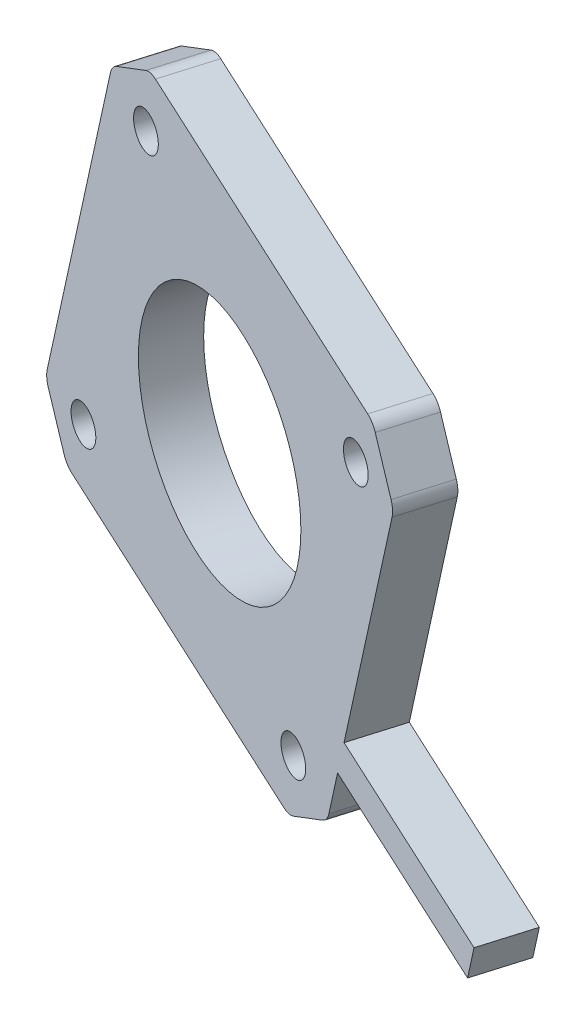
ISO-10303-21;
HEADER;
FILE_DESCRIPTION(('STEP AP214'),'2;1');
FILE_NAME('part.step','',(''),(''),'','','');
FILE_SCHEMA(('AUTOMOTIVE_DESIGN { 1 0 10303 214 1 1 1 1 }'));
ENDSEC;
DATA;
#1=APPLICATION_CONTEXT('core data for automotive mechanical design processes');
#2=APPLICATION_PROTOCOL_DEFINITION('international standard','automotive_design',2000,#1);
#3=PRODUCT_CONTEXT('',#1,'mechanical');
#4=PRODUCT('Part','Part','',(#3));
#5=PRODUCT_RELATED_PRODUCT_CATEGORY('part','',(#4));
#6=PRODUCT_DEFINITION_FORMATION('','',#4);
#7=PRODUCT_DEFINITION_CONTEXT('part definition',#1,'design');
#8=PRODUCT_DEFINITION('design','',#6,#7);
#9=PRODUCT_DEFINITION_SHAPE('','',#8);
#10=(LENGTH_UNIT() NAMED_UNIT(*) SI_UNIT(.MILLI.,.METRE.));
#11=(NAMED_UNIT(*) PLANE_ANGLE_UNIT() SI_UNIT($,.RADIAN.));
#12=(NAMED_UNIT(*) SI_UNIT($,.STERADIAN.) SOLID_ANGLE_UNIT());
#13=UNCERTAINTY_MEASURE_WITH_UNIT(LENGTH_MEASURE(1.E-05),#10,'distance_accuracy_value','');
#14=(GEOMETRIC_REPRESENTATION_CONTEXT(3) GLOBAL_UNCERTAINTY_ASSIGNED_CONTEXT((#13)) GLOBAL_UNIT_ASSIGNED_CONTEXT((#10,
#11,#12)) REPRESENTATION_CONTEXT('',''));
#15=CARTESIAN_POINT('',(0.,0.,0.));
#16=DIRECTION('',(0.,0.,1.));
#17=DIRECTION('',(1.,0.,0.));
#18=AXIS2_PLACEMENT_3D('',#15,#16,#17);
#19=CARTESIAN_POINT('',(201.174917099272,-83.0774959398372,13.686850654498));
#20=DIRECTION('',(-0.285333923385196,0.,0.958428167452111));
#21=DIRECTION('',(0.958428167452111,0.,0.285333923385196));
#22=AXIS2_PLACEMENT_3D('',#19,#20,#21);
#23=CYLINDRICAL_SURFACE('',#22,1.8);
#24=CARTESIAN_POINT('',(199.748247482346,-83.0774959398372,18.4789914917585));
#25=DIRECTION('',(0.285333923385196,0.,-0.958428167452111));
#26=DIRECTION('',(-0.958428167452111,0.,-0.285333923385196));
#27=AXIS2_PLACEMENT_3D('',#24,#25,#26);
#28=CIRCLE('',#27,1.8);
#29=CARTESIAN_POINT('',(201.265487859423,-82.220786831994,18.9306895576246));
#30=VERTEX_POINT('',#29);
#31=CARTESIAN_POINT('',(201.401699676244,-83.5910970019305,18.9712412165021));
#32=VERTEX_POINT('',#31);
#33=EDGE_CURVE('E228',#30,#32,#28,.T.);
#34=ORIENTED_EDGE('',*,*,#33,.T.);
#35=DIRECTION('',(-0.285333923385196,0.,0.958428167452111));
#36=VECTOR('',#35,1.);
#37=CARTESIAN_POINT('',(202.82836929317,-83.5910970019305,14.1791003792416));
#38=LINE('',#37,#36);
#39=CARTESIAN_POINT('',(202.82836929317,-83.5910970019305,14.1791003792416));
#40=VERTEX_POINT('',#39);
#41=EDGE_CURVE('E11',#40,#32,#38,.T.);
#42=ORIENTED_EDGE('',*,*,#41,.F.);
#43=CARTESIAN_POINT('',(201.174917099272,-83.0774959398372,13.686850654498));
#44=DIRECTION('',(0.285333923385196,0.,-0.958428167452111));
#45=DIRECTION('',(-0.958428167452111,0.,-0.285333923385196));
#46=AXIS2_PLACEMENT_3D('',#43,#44,#45);
#47=CIRCLE('',#46,1.8);
#48=CARTESIAN_POINT('',(202.692157476349,-82.220786831994,14.1385487203641));
#49=VERTEX_POINT('',#48);
#50=EDGE_CURVE('E348',#49,#40,#47,.T.);
#51=ORIENTED_EDGE('',*,*,#50,.F.);
#52=DIRECTION('',(-0.285333923385196,0.,0.958428167452111));
#53=VECTOR('',#52,1.);
#54=CARTESIAN_POINT('',(202.692157476349,-82.220786831994,14.1385487203641));
#55=LINE('',#54,#53);
#56=EDGE_CURVE('E224',#49,#30,#55,.T.);
#57=ORIENTED_EDGE('',*,*,#56,.T.);
#58=EDGE_LOOP('',(#34,#42,#51,#57));
#59=FACE_BOUND('',#58,.T.);
#60=ADVANCED_FACE('F43',(#59),#23,.T.);
#61=CARTESIAN_POINT('',(209.253259257463,-61.0740058405717,16.0918562049632));
#62=DIRECTION('',(-0.918584552165611,0.285333923385196,-0.273472069301994));
#63=DIRECTION('',(-0.2966419302804,-0.954988777525432,0.));
#64=AXIS2_PLACEMENT_3D('',#61,#62,#63);
#65=PLANE('',#64);
#66=DIRECTION('',(-0.273472069301994,-0.958428167452111,-0.0814154478343886));
#67=VECTOR('',#66,1.);
#68=CARTESIAN_POINT('',(207.826589640537,-61.0740058405717,20.8839970422238));
#69=LINE('',#68,#67);
#70=CARTESIAN_POINT('',(194.88716484802,-106.422363438587,17.0317971927438));
#71=VERTEX_POINT('',#70);
#72=EDGE_CURVE('E231',#32,#71,#69,.T.);
#73=ORIENTED_EDGE('',*,*,#72,.T.);
#74=DIRECTION('',(-0.285333923385196,0.,0.958428167452111));
#75=VECTOR('',#74,1.);
#76=CARTESIAN_POINT('',(196.313834464946,-106.422363438587,12.2396563554832));
#77=LINE('',#76,#75);
#78=CARTESIAN_POINT('',(196.313834464946,-106.422363438587,12.2396563554832));
#79=VERTEX_POINT('',#78);
#80=EDGE_CURVE('E52',#79,#71,#77,.T.);
#81=ORIENTED_EDGE('',*,*,#80,.F.);
#82=DIRECTION('',(-0.273472069301994,-0.958428167452111,-0.0814154478343886));
#83=VECTOR('',#82,1.);
#84=CARTESIAN_POINT('',(209.253259257463,-61.0740058405717,16.0918562049632));
#85=LINE('',#84,#83);
#86=EDGE_CURVE('E139',#40,#79,#85,.T.);
#87=ORIENTED_EDGE('',*,*,#86,.F.);
#88=ORIENTED_EDGE('',*,*,#41,.T.);
#89=EDGE_LOOP('',(#73,#81,#87,#88));
#90=FACE_BOUND('',#89,.T.);
#91=ADVANCED_FACE('F329',(#90),#65,.F.);
#92=CARTESIAN_POINT('',(-0.303650194546118,-45.3483575980144,-46.2953911412554));
#93=DIRECTION('',(0.273472069301998,0.95842816745211,0.0814154478343897));
#94=DIRECTION('',(-0.961620505139471,0.274382951539103,0.));
#95=AXIS2_PLACEMENT_3D('',#92,#93,#94);
#96=PLANE('',#95);
#97=DIRECTION('',(-0.91858455216561,0.285333923385199,-0.273472069301994));
#98=VECTOR('',#97,1.);
#99=CARTESIAN_POINT('',(-1.7303198114721,-45.3483575980144,-41.5032503039949));
#100=LINE('',#99,#98);
#101=CARTESIAN_POINT('',(212.5239882496,-111.900774767583,22.2824609233421));
#102=VERTEX_POINT('',#101);
#103=EDGE_CURVE('E234',#102,#71,#100,.T.);
#104=ORIENTED_EDGE('',*,*,#103,.F.);
#105=DIRECTION('',(-0.285333923385196,0.,0.958428167452111));
#106=VECTOR('',#105,1.);
#107=CARTESIAN_POINT('',(213.950657866526,-111.900774767583,17.4903200860815));
#108=LINE('',#107,#106);
#109=CARTESIAN_POINT('',(213.950657866526,-111.900774767583,17.4903200860815));
#110=VERTEX_POINT('',#109);
#111=EDGE_CURVE('E322',#110,#102,#108,.T.);
#112=ORIENTED_EDGE('',*,*,#111,.F.);
#113=DIRECTION('',(-0.91858455216561,0.285333923385199,-0.273472069301994));
#114=VECTOR('',#113,1.);
#115=CARTESIAN_POINT('',(-0.303650194546118,-45.3483575980144,-46.2953911412554));
#116=LINE('',#115,#114);
#117=EDGE_CURVE('E328',#110,#79,#116,.T.);
#118=ORIENTED_EDGE('',*,*,#117,.T.);
#119=ORIENTED_EDGE('',*,*,#80,.T.);
#120=EDGE_LOOP('',(#104,#112,#118,#119));
#121=FACE_BOUND('',#120,.T.);
#122=ADVANCED_FACE('F326',(#121),#96,.T.);
#123=CARTESIAN_POINT('',(226.890082659043,-66.5524171695616,21.3425199355617));
#124=DIRECTION('',(0.918584552165618,-0.285333923385172,0.273472069301996));
#125=DIRECTION('',(0.296641930280375,0.954988777525439,0.));
#126=AXIS2_PLACEMENT_3D('',#123,#124,#125);
#127=PLANE('',#126);
#128=DIRECTION('',(0.273472069301972,0.958428167452118,0.0814154478343819));
#129=VECTOR('',#128,1.);
#130=CARTESIAN_POINT('',(225.463413042117,-66.5524171695616,26.1346607728222));
#131=LINE('',#130,#129);
#132=CARTESIAN_POINT('',(211.648877627834,-114.967744903429,22.0219314902721));
#133=VERTEX_POINT('',#132);
#134=EDGE_CURVE('E238',#133,#102,#131,.T.);
#135=ORIENTED_EDGE('',*,*,#134,.F.);
#136=DIRECTION('',(-0.285333923385196,0.,0.958428167452111));
#137=VECTOR('',#136,1.);
#138=CARTESIAN_POINT('',(213.07554724476,-114.967744903429,17.2297906530115));
#139=LINE('',#138,#137);
#140=CARTESIAN_POINT('',(213.07554724476,-114.967744903429,17.2297906530115));
#141=VERTEX_POINT('',#140);
#142=EDGE_CURVE('E320',#141,#133,#139,.T.);
#143=ORIENTED_EDGE('',*,*,#142,.F.);
#144=DIRECTION('',(0.273472069301972,0.958428167452118,0.0814154478343819));
#145=VECTOR('',#144,1.);
#146=CARTESIAN_POINT('',(226.890082659043,-66.5524171695616,21.3425199355617));
#147=LINE('',#146,#145);
#148=EDGE_CURVE('E342',#141,#110,#147,.T.);
#149=ORIENTED_EDGE('',*,*,#148,.T.);
#150=ORIENTED_EDGE('',*,*,#111,.T.);
#151=EDGE_LOOP('',(#135,#143,#149,#150));
#152=FACE_BOUND('',#151,.T.);
#153=ADVANCED_FACE('F339',(#152),#127,.T.);
#154=CARTESIAN_POINT('',(-1.17876081631258,-48.4153277338623,-46.5559205743255));
#155=DIRECTION('',(-0.273472069301993,-0.958428167452111,-0.0814154478343883));
#156=DIRECTION('',(0.961620505139472,-0.274382951539098,0.));
#157=AXIS2_PLACEMENT_3D('',#154,#155,#156);
#158=PLANE('',#157);
#159=DIRECTION('',(0.918584552165612,-0.285333923385195,0.273472069301994));
#160=VECTOR('',#159,1.);
#161=CARTESIAN_POINT('',(-2.60543043323856,-48.4153277338623,-41.7637797370649));
#162=LINE('',#161,#160);
#163=CARTESIAN_POINT('',(194.012054226254,-109.489333574434,16.7712677596738));
#164=VERTEX_POINT('',#163);
#165=EDGE_CURVE('E241',#164,#133,#162,.T.);
#166=ORIENTED_EDGE('',*,*,#165,.F.);
#167=DIRECTION('',(-0.285333923385196,0.,0.958428167452111));
#168=VECTOR('',#167,1.);
#169=CARTESIAN_POINT('',(195.43872384318,-109.489333574434,11.9791269224132));
#170=LINE('',#169,#168);
#171=CARTESIAN_POINT('',(195.43872384318,-109.489333574434,11.9791269224132));
#172=VERTEX_POINT('',#171);
#173=EDGE_CURVE('E318',#172,#164,#170,.T.);
#174=ORIENTED_EDGE('',*,*,#173,.F.);
#175=DIRECTION('',(0.918584552165612,-0.285333923385195,0.273472069301994));
#176=VECTOR('',#175,1.);
#177=CARTESIAN_POINT('',(-1.17876081631258,-48.4153277338623,-46.5559205743255));
#178=LINE('',#177,#176);
#179=EDGE_CURVE('E346',#172,#141,#178,.T.);
#180=ORIENTED_EDGE('',*,*,#179,.T.);
#181=ORIENTED_EDGE('',*,*,#142,.T.);
#182=EDGE_LOOP('',(#166,#174,#180,#181));
#183=FACE_BOUND('',#182,.T.);
#184=ADVANCED_FACE('F410',(#183),#158,.T.);
#185=CARTESIAN_POINT('',(192.830224749419,-113.631250745774,16.419424968686));
#186=VERTEX_POINT('',#185);
#187=EDGE_CURVE('E235',#164,#186,#69,.T.);
#188=ORIENTED_EDGE('',*,*,#187,.T.);
#189=DIRECTION('',(-0.285333923385196,0.,0.958428167452111));
#190=VECTOR('',#189,1.);
#191=CARTESIAN_POINT('',(194.256894366345,-113.631250745774,11.6272841314255));
#192=LINE('',#191,#190);
#193=CARTESIAN_POINT('',(194.256894366345,-113.631250745774,11.6272841314255));
#194=VERTEX_POINT('',#193);
#195=EDGE_CURVE('E315',#194,#186,#192,.T.);
#196=ORIENTED_EDGE('',*,*,#195,.F.);
#197=EDGE_CURVE('E350',#172,#194,#85,.T.);
#198=ORIENTED_EDGE('',*,*,#197,.F.);
#199=ORIENTED_EDGE('',*,*,#173,.T.);
#200=EDGE_LOOP('',(#188,#196,#198,#199));
#201=FACE_BOUND('',#200,.T.);
#202=ADVANCED_FACE('F404',(#201),#65,.F.);
#203=CARTESIAN_POINT('',(192.603442172447,-113.117649683681,11.1350344066819));
#204=DIRECTION('',(-0.285333923385196,0.,0.958428167452111));
#205=DIRECTION('',(0.958428167452111,0.,0.285333923385196));
#206=AXIS2_PLACEMENT_3D('',#203,#204,#205);
#207=CYLINDRICAL_SURFACE('',#206,1.8);
#208=CARTESIAN_POINT('',(191.176772555521,-113.117649683681,15.9271752439425));
#209=DIRECTION('',(0.285333923385196,0.,-0.958428167452111));
#210=DIRECTION('',(-0.958428167452111,0.,-0.285333923385196));
#211=AXIS2_PLACEMENT_3D('',#208,#209,#210);
#212=CIRCLE('',#211,1.8);
#213=CARTESIAN_POINT('',(191.997866695791,-114.700700379186,16.1716234148832));
#214=VERTEX_POINT('',#213);
#215=EDGE_CURVE('E244',#186,#214,#212,.T.);
#216=ORIENTED_EDGE('',*,*,#215,.T.);
#217=DIRECTION('',(-0.285333923385196,0.,0.958428167452111));
#218=VECTOR('',#217,1.);
#219=CARTESIAN_POINT('',(193.424536312717,-114.700700379186,11.3794825776227));
#220=LINE('',#219,#218);
#221=CARTESIAN_POINT('',(193.424536312717,-114.700700379186,11.3794825776227));
#222=VERTEX_POINT('',#221);
#223=EDGE_CURVE('E312',#222,#214,#220,.T.);
#224=ORIENTED_EDGE('',*,*,#223,.F.);
#225=CARTESIAN_POINT('',(192.603442172447,-113.117649683681,11.1350344066819));
#226=DIRECTION('',(0.285333923385196,0.,-0.958428167452111));
#227=DIRECTION('',(-0.958428167452111,0.,-0.285333923385196));
#228=AXIS2_PLACEMENT_3D('',#225,#226,#227);
#229=CIRCLE('',#228,1.8);
#230=EDGE_CURVE('E354',#194,#222,#229,.T.);
#231=ORIENTED_EDGE('',*,*,#230,.F.);
#232=ORIENTED_EDGE('',*,*,#195,.T.);
#233=EDGE_LOOP('',(#216,#224,#231,#232));
#234=FACE_BOUND('',#233,.T.);
#235=ADVANCED_FACE('F415',(#234),#207,.T.);
#236=CARTESIAN_POINT('',(99.6054755998931,-167.675591514658,-16.5514167746664));
#237=DIRECTION('',(-0.456163411260954,0.879472608613818,-0.135804539411522));
#238=DIRECTION('',(-0.887696540554657,-0.460428986801759,0.));
#239=AXIS2_PLACEMENT_3D('',#236,#237,#238);
#240=PLANE('',#239);
#241=DIRECTION('',(-0.842911320598069,-0.475949504357349,-0.250943369925593));
#242=VECTOR('',#241,1.);
#243=CARTESIAN_POINT('',(98.1788059829671,-167.675591514658,-11.7592759374059));
#244=LINE('',#243,#242);
#245=CARTESIAN_POINT('',(188.030193102664,-116.941045518648,14.9904061766126));
#246=VERTEX_POINT('',#245);
#247=EDGE_CURVE('E246',#214,#246,#244,.T.);
#248=ORIENTED_EDGE('',*,*,#247,.T.);
#249=DIRECTION('',(-0.285333923385196,0.,0.958428167452111));
#250=VECTOR('',#249,1.);
#251=CARTESIAN_POINT('',(189.45686271959,-116.941045518648,10.1982653393521));
#252=LINE('',#251,#250);
#253=CARTESIAN_POINT('',(189.45686271959,-116.941045518648,10.1982653393521));
#254=VERTEX_POINT('',#253);
#255=EDGE_CURVE('E309',#254,#246,#252,.T.);
#256=ORIENTED_EDGE('',*,*,#255,.F.);
#257=DIRECTION('',(-0.842911320598069,-0.475949504357349,-0.250943369925593));
#258=VECTOR('',#257,1.);
#259=CARTESIAN_POINT('',(99.6054755998931,-167.675591514658,-16.5514167746664));
#260=LINE('',#259,#258);
#261=EDGE_CURVE('E356',#222,#254,#260,.T.);
#262=ORIENTED_EDGE('',*,*,#261,.F.);
#263=ORIENTED_EDGE('',*,*,#223,.T.);
#264=EDGE_LOOP('',(#248,#256,#262,#263));
#265=FACE_BOUND('',#264,.T.);
#266=ADVANCED_FACE('F419',(#265),#240,.F.);
#267=CARTESIAN_POINT('',(188.635768579321,-115.357994823143,9.95381716841133));
#268=DIRECTION('',(-0.285333923385196,0.,0.958428167452111));
#269=DIRECTION('',(0.958428167452111,0.,0.285333923385196));
#270=AXIS2_PLACEMENT_3D('',#267,#268,#269);
#271=CYLINDRICAL_SURFACE('',#270,1.8);
#272=CARTESIAN_POINT('',(187.209098962395,-115.357994823143,14.7459580056719));
#273=DIRECTION('',(0.285333923385196,0.,-0.958428167452111));
#274=DIRECTION('',(-0.958428167452111,0.,-0.285333923385196));
#275=AXIS2_PLACEMENT_3D('',#272,#273,#274);
#276=CIRCLE('',#275,1.8);
#277=CARTESIAN_POINT('',(186.716849237651,-117.083165524557,14.59941019957));
#278=VERTEX_POINT('',#277);
#279=EDGE_CURVE('E248',#246,#278,#276,.T.);
#280=ORIENTED_EDGE('',*,*,#279,.T.);
#281=DIRECTION('',(-0.285333923385196,0.,0.958428167452111));
#282=VECTOR('',#281,1.);
#283=CARTESIAN_POINT('',(188.143518854577,-117.083165524557,9.80726936230944));
#284=LINE('',#283,#282);
#285=CARTESIAN_POINT('',(188.143518854577,-117.083165524557,9.80726936230944));
#286=VERTEX_POINT('',#285);
#287=EDGE_CURVE('E306',#286,#278,#284,.T.);
#288=ORIENTED_EDGE('',*,*,#287,.F.);
#289=CARTESIAN_POINT('',(188.635768579321,-115.357994823143,9.95381716841133));
#290=DIRECTION('',(0.285333923385196,0.,-0.958428167452111));
#291=DIRECTION('',(-0.958428167452111,0.,-0.285333923385196));
#292=AXIS2_PLACEMENT_3D('',#289,#290,#291);
#293=CIRCLE('',#292,1.8);
#294=EDGE_CURVE('E358',#254,#286,#293,.T.);
#295=ORIENTED_EDGE('',*,*,#294,.F.);
#296=ORIENTED_EDGE('',*,*,#255,.T.);
#297=EDGE_LOOP('',(#280,#288,#295,#296));
#298=FACE_BOUND('',#297,.T.);
#299=ADVANCED_FACE('F423',(#298),#271,.T.);
#300=CARTESIAN_POINT('',(-3.7630718712164,-57.4724739162845,-47.3252965563605));
#301=DIRECTION('',(0.273472069301994,0.958428167452111,0.0814154478343885));
#302=DIRECTION('',(-0.961620505139472,0.274382951539099,0.));
#303=AXIS2_PLACEMENT_3D('',#300,#301,#302);
#304=PLANE('',#303);
#305=DIRECTION('',(-0.918584552165611,0.285333923385195,-0.273472069301994));
#306=VECTOR('',#305,1.);
#307=CARTESIAN_POINT('',(-5.18974148814238,-57.4724739162845,-42.5331557190999));
#308=LINE('',#307,#306);
#309=CARTESIAN_POINT('',(157.92551973496,-108.139902776331,6.02793527274466));
#310=VERTEX_POINT('',#309);
#311=EDGE_CURVE('E250',#278,#310,#308,.T.);
#312=ORIENTED_EDGE('',*,*,#311,.T.);
#313=DIRECTION('',(-0.285333923385196,0.,0.958428167452111));
#314=VECTOR('',#313,1.);
#315=CARTESIAN_POINT('',(159.352189351886,-108.139902776331,1.2357944354841));
#316=LINE('',#315,#314);
#317=CARTESIAN_POINT('',(159.352189351886,-108.139902776331,1.2357944354841));
#318=VERTEX_POINT('',#317);
#319=EDGE_CURVE('E303',#318,#310,#316,.T.);
#320=ORIENTED_EDGE('',*,*,#319,.F.);
#321=DIRECTION('',(-0.918584552165611,0.285333923385195,-0.273472069301994));
#322=VECTOR('',#321,1.);
#323=CARTESIAN_POINT('',(-3.7630718712164,-57.4724739162845,-47.3252965563605));
#324=LINE('',#323,#322);
#325=EDGE_CURVE('E360',#286,#318,#324,.T.);
#326=ORIENTED_EDGE('',*,*,#325,.F.);
#327=ORIENTED_EDGE('',*,*,#287,.T.);
#328=EDGE_LOOP('',(#312,#320,#326,#327));
#329=FACE_BOUND('',#328,.T.);
#330=ADVANCED_FACE('F427',(#329),#304,.F.);
#331=CARTESIAN_POINT('',(159.844439076629,-106.414732074917,1.382342241586));
#332=DIRECTION('',(-0.285333923385196,0.,0.958428167452111));
#333=DIRECTION('',(0.958428167452111,0.,0.285333923385196));
#334=AXIS2_PLACEMENT_3D('',#331,#332,#333);
#335=CYLINDRICAL_SURFACE('',#334,1.8);
#336=CARTESIAN_POINT('',(158.417769459703,-106.414732074917,6.17448307884656));
#337=DIRECTION('',(0.285333923385196,0.,-0.958428167452111));
#338=DIRECTION('',(-0.958428167452111,0.,-0.285333923385196));
#339=AXIS2_PLACEMENT_3D('',#336,#337,#338);
#340=CIRCLE('',#339,1.8);
#341=CARTESIAN_POINT('',(156.900529082627,-107.27144118276,5.72278501298049));
#342=VERTEX_POINT('',#341);
#343=EDGE_CURVE('E252',#310,#342,#340,.T.);
#344=ORIENTED_EDGE('',*,*,#343,.T.);
#345=DIRECTION('',(-0.285333923385196,0.,0.958428167452111));
#346=VECTOR('',#345,1.);
#347=CARTESIAN_POINT('',(158.327198699553,-107.27144118276,0.930644175719936));
#348=LINE('',#347,#346);
#349=CARTESIAN_POINT('',(158.327198699553,-107.27144118276,0.930644175719936));
#350=VERTEX_POINT('',#349);
#351=EDGE_CURVE('E300',#350,#342,#348,.T.);
#352=ORIENTED_EDGE('',*,*,#351,.F.);
#353=CARTESIAN_POINT('',(159.844439076629,-106.414732074917,1.382342241586));
#354=DIRECTION('',(0.285333923385196,0.,-0.958428167452111));
#355=DIRECTION('',(-0.958428167452111,0.,-0.285333923385196));
#356=AXIS2_PLACEMENT_3D('',#353,#354,#355);
#357=CIRCLE('',#356,1.8);
#358=EDGE_CURVE('E362',#318,#350,#357,.T.);
#359=ORIENTED_EDGE('',*,*,#358,.F.);
#360=ORIENTED_EDGE('',*,*,#319,.T.);
#361=EDGE_LOOP('',(#344,#352,#359,#360));
#362=FACE_BOUND('',#361,.T.);
#363=ADVANCED_FACE('F431',(#362),#335,.T.);
#364=CARTESIAN_POINT('',(82.2885191258326,39.3293913903581,-21.7068528309437));
#365=DIRECTION('',(0.842911320598069,0.475949504357349,0.250943369925593));
#366=DIRECTION('',(-0.491682473650863,0.870774566179197,0.));
#367=AXIS2_PLACEMENT_3D('',#364,#365,#366);
#368=PLANE('',#367);
#369=DIRECTION('',(-0.456163411260954,0.879472608613818,-0.135804539411522));
#370=VECTOR('',#369,1.);
#371=CARTESIAN_POINT('',(80.8618495089067,39.3293913903581,-16.9147119936832));
#372=LINE('',#371,#370);
#373=CARTESIAN_POINT('',(154.753319196151,-103.131669702886,5.08353854460059));
#374=VERTEX_POINT('',#373);
#375=EDGE_CURVE('E254',#342,#374,#372,.T.);
#376=ORIENTED_EDGE('',*,*,#375,.T.);
#377=DIRECTION('',(-0.285333923385196,0.,0.958428167452111));
#378=VECTOR('',#377,1.);
#379=CARTESIAN_POINT('',(156.179988813077,-103.131669702886,0.291397707340032));
#380=LINE('',#379,#378);
#381=CARTESIAN_POINT('',(156.179988813077,-103.131669702886,0.291397707340032));
#382=VERTEX_POINT('',#381);
#383=EDGE_CURVE('E297',#382,#374,#380,.T.);
#384=ORIENTED_EDGE('',*,*,#383,.F.);
#385=DIRECTION('',(-0.456163411260954,0.879472608613818,-0.135804539411522));
#386=VECTOR('',#385,1.);
#387=CARTESIAN_POINT('',(82.2885191258326,39.3293913903581,-21.7068528309437));
#388=LINE('',#387,#386);
#389=EDGE_CURVE('E364',#350,#382,#388,.T.);
#390=ORIENTED_EDGE('',*,*,#389,.F.);
#391=ORIENTED_EDGE('',*,*,#351,.T.);
#392=EDGE_LOOP('',(#376,#384,#390,#391));
#393=FACE_BOUND('',#392,.T.);
#394=ADVANCED_FACE('F435',(#393),#368,.F.);
#395=CARTESIAN_POINT('',(157.697229190154,-102.274960595043,0.743095773206102));
#396=DIRECTION('',(-0.285333923385196,0.,0.958428167452111));
#397=DIRECTION('',(0.958428167452111,0.,0.285333923385196));
#398=AXIS2_PLACEMENT_3D('',#395,#396,#397);
#399=CYLINDRICAL_SURFACE('',#398,1.8);
#400=CARTESIAN_POINT('',(156.270559573228,-102.274960595043,5.53523661046666));
#401=DIRECTION('',(0.285333923385196,0.,-0.958428167452111));
#402=DIRECTION('',(-0.958428167452111,0.,-0.285333923385196));
#403=AXIS2_PLACEMENT_3D('',#400,#401,#402);
#404=CIRCLE('',#403,1.8);
#405=CARTESIAN_POINT('',(154.617107379329,-101.76135953295,5.04298688572308));
#406=VERTEX_POINT('',#405);
#407=EDGE_CURVE('E256',#374,#406,#404,.T.);
#408=ORIENTED_EDGE('',*,*,#407,.T.);
#409=DIRECTION('',(-0.285333923385196,0.,0.958428167452111));
#410=VECTOR('',#409,1.);
#411=CARTESIAN_POINT('',(156.043776996255,-101.76135953295,0.250846048462528));
#412=LINE('',#411,#410);
#413=CARTESIAN_POINT('',(156.043776996255,-101.76135953295,0.250846048462528));
#414=VERTEX_POINT('',#413);
#415=EDGE_CURVE('E294',#414,#406,#412,.T.);
#416=ORIENTED_EDGE('',*,*,#415,.F.);
#417=CARTESIAN_POINT('',(157.697229190154,-102.274960595043,0.743095773206102));
#418=DIRECTION('',(0.285333923385196,0.,-0.958428167452111));
#419=DIRECTION('',(-0.958428167452111,0.,-0.285333923385196));
#420=AXIS2_PLACEMENT_3D('',#417,#418,#419);
#421=CIRCLE('',#420,1.8);
#422=EDGE_CURVE('E366',#382,#414,#421,.T.);
#423=ORIENTED_EDGE('',*,*,#422,.F.);
#424=ORIENTED_EDGE('',*,*,#383,.T.);
#425=EDGE_LOOP('',(#408,#416,#423,#424));
#426=FACE_BOUND('',#425,.T.);
#427=ADVANCED_FACE('F439',(#426),#399,.T.);
#428=CARTESIAN_POINT('',(171.040141887373,-49.2041146277476,4.7154181220003));
#429=DIRECTION('',(0.918584552165611,-0.285333923385196,0.273472069301994));
#430=DIRECTION('',(0.2966419302804,0.954988777525432,0.));
#431=AXIS2_PLACEMENT_3D('',#428,#429,#430);
#432=PLANE('',#431);
#433=DIRECTION('',(0.273472069301994,0.958428167452111,0.0814154478343886));
#434=VECTOR('',#433,1.);
#435=CARTESIAN_POINT('',(169.613472270447,-49.2041146277476,9.50755895926086));
#436=LINE('',#435,#434);
#437=CARTESIAN_POINT('',(163.188582306155,-71.7212057891064,7.59480313353918));
#438=VERTEX_POINT('',#437);
#439=EDGE_CURVE('E258',#406,#438,#436,.T.);
#440=ORIENTED_EDGE('',*,*,#439,.T.);
#441=DIRECTION('',(-0.285333923385196,0.,0.958428167452111));
#442=VECTOR('',#441,1.);
#443=CARTESIAN_POINT('',(164.615251923081,-71.7212057891064,2.80266229627863));
#444=LINE('',#443,#442);
#445=CARTESIAN_POINT('',(164.615251923081,-71.7212057891064,2.80266229627863));
#446=VERTEX_POINT('',#445);
#447=EDGE_CURVE('E291',#446,#438,#444,.T.);
#448=ORIENTED_EDGE('',*,*,#447,.F.);
#449=DIRECTION('',(0.273472069301994,0.958428167452111,0.0814154478343886));
#450=VECTOR('',#449,1.);
#451=CARTESIAN_POINT('',(171.040141887373,-49.2041146277476,4.7154181220003));
#452=LINE('',#451,#450);
#453=EDGE_CURVE('E368',#414,#446,#452,.T.);
#454=ORIENTED_EDGE('',*,*,#453,.F.);
#455=ORIENTED_EDGE('',*,*,#415,.T.);
#456=EDGE_LOOP('',(#440,#448,#454,#455));
#457=FACE_BOUND('',#456,.T.);
#458=ADVANCED_FACE('F443',(#457),#432,.F.);
#459=CARTESIAN_POINT('',(166.268704116979,-72.2348068511998,3.29491202102222));
#460=DIRECTION('',(-0.285333923385196,0.,0.958428167452111));
#461=DIRECTION('',(0.958428167452111,0.,0.285333923385196));
#462=AXIS2_PLACEMENT_3D('',#459,#460,#461);
#463=CYLINDRICAL_SURFACE('',#462,1.8);
#464=CARTESIAN_POINT('',(164.842034500053,-72.2348068511998,8.08705285828278));
#465=DIRECTION('',(0.285333923385196,0.,-0.958428167452111));
#466=DIRECTION('',(-0.958428167452111,0.,-0.285333923385196));
#467=AXIS2_PLACEMENT_3D('',#464,#465,#466);
#468=CIRCLE('',#467,1.8);
#469=CARTESIAN_POINT('',(164.020940359783,-70.6517561556949,7.84260468734201));
#470=VERTEX_POINT('',#469);
#471=EDGE_CURVE('E260',#438,#470,#468,.T.);
#472=ORIENTED_EDGE('',*,*,#471,.T.);
#473=DIRECTION('',(-0.285333923385196,0.,0.958428167452111));
#474=VECTOR('',#473,1.);
#475=CARTESIAN_POINT('',(165.447609976709,-70.6517561556949,3.05046385008146));
#476=LINE('',#475,#474);
#477=CARTESIAN_POINT('',(165.447609976709,-70.6517561556949,3.05046385008146));
#478=VERTEX_POINT('',#477);
#479=EDGE_CURVE('E288',#478,#470,#476,.T.);
#480=ORIENTED_EDGE('',*,*,#479,.F.);
#481=CARTESIAN_POINT('',(166.268704116979,-72.2348068511998,3.29491202102222));
#482=DIRECTION('',(0.285333923385196,0.,-0.958428167452111));
#483=DIRECTION('',(-0.958428167452111,0.,-0.285333923385196));
#484=AXIS2_PLACEMENT_3D('',#481,#482,#483);
#485=CIRCLE('',#484,1.8);
#486=EDGE_CURVE('E370',#446,#478,#485,.T.);
#487=ORIENTED_EDGE('',*,*,#486,.F.);
#488=ORIENTED_EDGE('',*,*,#447,.T.);
#489=EDGE_LOOP('',(#472,#480,#487,#488));
#490=FACE_BOUND('',#489,.T.);
#491=ADVANCED_FACE('F447',(#490),#463,.T.);
#492=CARTESIAN_POINT('',(75.5962228570118,-121.386302151705,-23.699218263937));
#493=DIRECTION('',(0.456163411260954,-0.879472608613818,0.135804539411522));
#494=DIRECTION('',(0.887696540554657,0.460428986801759,0.));
#495=AXIS2_PLACEMENT_3D('',#492,#493,#494);
#496=PLANE('',#495);
#497=DIRECTION('',(0.842911320598069,0.475949504357349,0.250943369925593));
#498=VECTOR('',#497,1.);
#499=CARTESIAN_POINT('',(74.1695532400858,-121.386302151705,-18.9070774266765));
#500=LINE('',#499,#498);
#501=CARTESIAN_POINT('',(167.988613952909,-68.411411016232,9.02382192561257));
#502=VERTEX_POINT('',#501);
#503=EDGE_CURVE('E262',#470,#502,#500,.T.);
#504=ORIENTED_EDGE('',*,*,#503,.T.);
#505=DIRECTION('',(-0.285333923385196,0.,0.958428167452111));
#506=VECTOR('',#505,1.);
#507=CARTESIAN_POINT('',(169.415283569835,-68.411411016232,4.23168108835202));
#508=LINE('',#507,#506);
#509=CARTESIAN_POINT('',(169.415283569835,-68.411411016232,4.23168108835202));
#510=VERTEX_POINT('',#509);
#511=EDGE_CURVE('E285',#510,#502,#508,.T.);
#512=ORIENTED_EDGE('',*,*,#511,.F.);
#513=DIRECTION('',(0.842911320598069,0.475949504357349,0.250943369925593));
#514=VECTOR('',#513,1.);
#515=CARTESIAN_POINT('',(75.5962228570118,-121.386302151705,-23.699218263937));
#516=LINE('',#515,#514);
#517=EDGE_CURVE('E372',#478,#510,#516,.T.);
#518=ORIENTED_EDGE('',*,*,#517,.F.);
#519=ORIENTED_EDGE('',*,*,#479,.T.);
#520=EDGE_LOOP('',(#504,#512,#518,#519));
#521=FACE_BOUND('',#520,.T.);
#522=ADVANCED_FACE('F378',(#521),#496,.F.);
#523=CARTESIAN_POINT('',(170.236377710105,-69.9944617117369,4.47612925929277));
#524=DIRECTION('',(-0.285333923385196,0.,0.958428167452111));
#525=DIRECTION('',(0.958428167452111,0.,0.285333923385196));
#526=AXIS2_PLACEMENT_3D('',#523,#524,#525);
#527=CYLINDRICAL_SURFACE('',#526,1.8);
#528=CARTESIAN_POINT('',(168.809708093179,-69.9944617117369,9.26827009655332));
#529=DIRECTION('',(0.285333923385196,0.,-0.958428167452111));
#530=DIRECTION('',(-0.958428167452111,0.,-0.285333923385196));
#531=AXIS2_PLACEMENT_3D('',#528,#529,#530);
#532=CIRCLE('',#531,1.8);
#533=CARTESIAN_POINT('',(169.301957817922,-68.2692910103231,9.41481790265521));
#534=VERTEX_POINT('',#533);
#535=EDGE_CURVE('E264',#502,#534,#532,.T.);
#536=ORIENTED_EDGE('',*,*,#535,.T.);
#537=DIRECTION('',(-0.285333923385196,0.,0.958428167452111));
#538=VECTOR('',#537,1.);
#539=CARTESIAN_POINT('',(170.728627434848,-68.2692910103231,4.62267706539466));
#540=LINE('',#539,#538);
#541=CARTESIAN_POINT('',(170.728627434848,-68.2692910103231,4.62267706539466));
#542=VERTEX_POINT('',#541);
#543=EDGE_CURVE('E204',#542,#534,#540,.T.);
#544=ORIENTED_EDGE('',*,*,#543,.F.);
#545=CARTESIAN_POINT('',(170.236377710105,-69.9944617117369,4.47612925929277));
#546=DIRECTION('',(0.285333923385196,0.,-0.958428167452111));
#547=DIRECTION('',(-0.958428167452111,0.,-0.285333923385196));
#548=AXIS2_PLACEMENT_3D('',#545,#546,#547);
#549=CIRCLE('',#548,1.8);
#550=EDGE_CURVE('E195',#510,#542,#549,.T.);
#551=ORIENTED_EDGE('',*,*,#550,.F.);
#552=ORIENTED_EDGE('',*,*,#511,.T.);
#553=EDGE_LOOP('',(#536,#544,#551,#552));
#554=FACE_BOUND('',#553,.T.);
#555=ADVANCED_FACE('F382',(#554),#527,.T.);
#556=CARTESIAN_POINT('',(7.61336621174655,-17.6018621502766,-43.9384139264499));
#557=DIRECTION('',(-0.273472069301994,-0.958428167452111,-0.0814154478343886));
#558=DIRECTION('',(0.961620505139472,-0.274382951539099,0.));
#559=AXIS2_PLACEMENT_3D('',#556,#557,#558);
#560=PLANE('',#559);
#561=DIRECTION('',(0.918584552165611,-0.285333923385196,0.273472069301994));
#562=VECTOR('',#561,1.);
#563=CARTESIAN_POINT('',(6.18669659482057,-17.6018621502766,-39.1462730891893));
#564=LINE('',#563,#562);
#565=CARTESIAN_POINT('',(198.093287320614,-77.2125537585495,17.9862928294805));
#566=VERTEX_POINT('',#565);
#567=EDGE_CURVE('E203',#534,#566,#564,.T.);
#568=ORIENTED_EDGE('',*,*,#567,.T.);
#569=DIRECTION('',(-0.285333923385196,0.,0.958428167452111));
#570=VECTOR('',#569,1.);
#571=CARTESIAN_POINT('',(199.51995693754,-77.2125537585495,13.19415199222));
#572=LINE('',#571,#570);
#573=CARTESIAN_POINT('',(199.51995693754,-77.2125537585495,13.19415199222));
#574=VERTEX_POINT('',#573);
#575=EDGE_CURVE('E200',#574,#566,#572,.T.);
#576=ORIENTED_EDGE('',*,*,#575,.F.);
#577=DIRECTION('',(0.918584552165611,-0.285333923385196,0.273472069301994));
#578=VECTOR('',#577,1.);
#579=CARTESIAN_POINT('',(7.61336621174655,-17.6018621502766,-43.9384139264499));
#580=LINE('',#579,#578);
#581=EDGE_CURVE('E188',#542,#574,#580,.T.);
#582=ORIENTED_EDGE('',*,*,#581,.F.);
#583=ORIENTED_EDGE('',*,*,#543,.T.);
#584=EDGE_LOOP('',(#568,#576,#582,#583));
#585=FACE_BOUND('',#584,.T.);
#586=ADVANCED_FACE('F201',(#585),#560,.F.);
#587=CARTESIAN_POINT('',(199.027707212796,-78.9377244599633,13.0476041861181));
#588=DIRECTION('',(-0.285333923385196,0.,0.958428167452111));
#589=DIRECTION('',(0.958428167452111,0.,0.285333923385196));
#590=AXIS2_PLACEMENT_3D('',#587,#588,#589);
#591=CYLINDRICAL_SURFACE('',#590,1.8);
#592=CARTESIAN_POINT('',(197.60103759587,-78.9377244599633,17.8397450233786));
#593=DIRECTION('',(0.285333923385196,0.,-0.958428167452111));
#594=DIRECTION('',(-0.958428167452111,0.,-0.285333923385196));
#595=AXIS2_PLACEMENT_3D('',#592,#593,#594);
#596=CIRCLE('',#595,1.8);
#597=CARTESIAN_POINT('',(199.118277972947,-78.08101535212,18.2914430892447));
#598=VERTEX_POINT('',#597);
#599=EDGE_CURVE('E125',#566,#598,#596,.T.);
#600=ORIENTED_EDGE('',*,*,#599,.T.);
#601=DIRECTION('',(-0.285333923385196,0.,0.958428167452111));
#602=VECTOR('',#601,1.);
#603=CARTESIAN_POINT('',(200.544947589873,-78.08101535212,13.4993022519842));
#604=LINE('',#603,#602);
#605=CARTESIAN_POINT('',(200.544947589873,-78.08101535212,13.4993022519842));
#606=VERTEX_POINT('',#605);
#607=EDGE_CURVE('E205',#606,#598,#604,.T.);
#608=ORIENTED_EDGE('',*,*,#607,.F.);
#609=CARTESIAN_POINT('',(199.027707212796,-78.9377244599633,13.0476041861181));
#610=DIRECTION('',(0.285333923385196,0.,-0.958428167452111));
#611=DIRECTION('',(-0.958428167452111,0.,-0.285333923385196));
#612=AXIS2_PLACEMENT_3D('',#609,#610,#611);
#613=CIRCLE('',#612,1.8);
#614=EDGE_CURVE('E193',#574,#606,#613,.T.);
#615=ORIENTED_EDGE('',*,*,#614,.F.);
#616=ORIENTED_EDGE('',*,*,#575,.T.);
#617=EDGE_LOOP('',(#600,#608,#615,#616));
#618=FACE_BOUND('',#617,.T.);
#619=ADVANCED_FACE('F207',(#618),#591,.T.);
#620=CARTESIAN_POINT('',(189.435316629099,-111.954540675418,10.1918508465999));
#621=DIRECTION('',(-0.285333923385196,0.,0.958428167452111));
#622=DIRECTION('',(0.958428167452111,0.,0.285333923385196));
#623=AXIS2_PLACEMENT_3D('',#620,#621,#622);
#624=CYLINDRICAL_SURFACE('',#623,1.75000000000004);
#625=CARTESIAN_POINT('',(189.435316629099,-111.954540675418,10.1918508465999));
#626=DIRECTION('',(0.285333923385196,0.,-0.958428167452111));
#627=DIRECTION('',(-0.958428167452111,0.,-0.285333923385196));
#628=AXIS2_PLACEMENT_3D('',#625,#626,#627);
#629=CIRCLE('',#628,1.75000000000004);
#630=CARTESIAN_POINT('',(187.758067336058,-111.954540675418,9.69251648067582));
#631=VERTEX_POINT('',#630);
#632=EDGE_CURVE('E218',#631,#631,#629,.T.);
#633=ORIENTED_EDGE('',*,*,#632,.T.);
#634=EDGE_LOOP('',(#633));
#635=FACE_BOUND('',#634,.T.);
#636=CARTESIAN_POINT('',(188.008647012173,-111.954540675418,14.9839916838605));
#637=DIRECTION('',(0.285333923385196,0.,-0.958428167452111));
#638=DIRECTION('',(-0.958428167452111,0.,-0.285333923385196));
#639=AXIS2_PLACEMENT_3D('',#636,#637,#638);
#640=CIRCLE('',#639,1.75000000000004);
#641=CARTESIAN_POINT('',(186.331397719132,-111.954540675418,14.4846573179364));
#642=VERTEX_POINT('',#641);
#643=EDGE_CURVE('E275',#642,#642,#640,.T.);
#644=ORIENTED_EDGE('',*,*,#643,.F.);
#645=EDGE_LOOP('',(#644));
#646=FACE_BOUND('',#645,.T.);
#647=ADVANCED_FACE('F458',(#635,#646),#624,.F.);
#648=CARTESIAN_POINT('',(197.912950777461,-82.243267484403,12.715729729466));
#649=DIRECTION('',(-0.285333923385196,0.,0.958428167452111));
#650=DIRECTION('',(0.958428167452111,0.,0.285333923385196));
#651=AXIS2_PLACEMENT_3D('',#648,#649,#650);
#652=CYLINDRICAL_SURFACE('',#651,1.75000000000004);
#653=CARTESIAN_POINT('',(197.912950777461,-82.243267484403,12.715729729466));
#654=DIRECTION('',(0.285333923385196,0.,-0.958428167452111));
#655=DIRECTION('',(-0.958428167452111,0.,-0.285333923385196));
#656=AXIS2_PLACEMENT_3D('',#653,#654,#655);
#657=CIRCLE('',#656,1.75000000000004);
#658=CARTESIAN_POINT('',(196.235701484419,-82.243267484403,12.2163953635419));
#659=VERTEX_POINT('',#658);
#660=EDGE_CURVE('E215',#659,#659,#657,.T.);
#661=ORIENTED_EDGE('',*,*,#660,.T.);
#662=EDGE_LOOP('',(#661));
#663=FACE_BOUND('',#662,.T.);
#664=CARTESIAN_POINT('',(196.486281160535,-82.243267484403,17.5078705667265));
#665=DIRECTION('',(0.285333923385196,0.,-0.958428167452111));
#666=DIRECTION('',(-0.958428167452111,0.,-0.285333923385196));
#667=AXIS2_PLACEMENT_3D('',#664,#665,#666);
#668=CIRCLE('',#667,1.75000000000004);
#669=CARTESIAN_POINT('',(194.809031867493,-82.243267484403,17.0085362008024));
#670=VERTEX_POINT('',#669);
#671=EDGE_CURVE('E272',#670,#670,#668,.T.);
#672=ORIENTED_EDGE('',*,*,#671,.F.);
#673=EDGE_LOOP('',(#672));
#674=FACE_BOUND('',#673,.T.);
#675=ADVANCED_FACE('F395',(#663,#674),#652,.F.);
#676=CARTESIAN_POINT('',(169.436829660327,-73.3979158594619,4.23809558110415));
#677=DIRECTION('',(-0.285333923385196,0.,0.958428167452111));
#678=DIRECTION('',(0.958428167452111,0.,0.285333923385196));
#679=AXIS2_PLACEMENT_3D('',#676,#677,#678);
#680=CYLINDRICAL_SURFACE('',#679,1.75000000000004);
#681=CARTESIAN_POINT('',(169.436829660327,-73.3979158594619,4.23809558110415));
#682=DIRECTION('',(0.285333923385196,0.,-0.958428167452111));
#683=DIRECTION('',(-0.958428167452111,0.,-0.285333923385196));
#684=AXIS2_PLACEMENT_3D('',#681,#682,#683);
#685=CIRCLE('',#684,1.75000000000004);
#686=CARTESIAN_POINT('',(167.759580367285,-73.3979158594619,3.73876121518004));
#687=VERTEX_POINT('',#686);
#688=EDGE_CURVE('E209',#687,#687,#685,.T.);
#689=ORIENTED_EDGE('',*,*,#688,.T.);
#690=EDGE_LOOP('',(#689));
#691=FACE_BOUND('',#690,.T.);
#692=CARTESIAN_POINT('',(168.010160043401,-73.3979158594619,9.0302364183647));
#693=DIRECTION('',(0.285333923385196,0.,-0.958428167452111));
#694=DIRECTION('',(-0.958428167452111,0.,-0.285333923385196));
#695=AXIS2_PLACEMENT_3D('',#692,#693,#694);
#696=CIRCLE('',#695,1.75000000000004);
#697=CARTESIAN_POINT('',(166.33291075036,-73.3979158594619,8.5309020524406));
#698=VERTEX_POINT('',#697);
#699=EDGE_CURVE('E269',#698,#698,#696,.T.);
#700=ORIENTED_EDGE('',*,*,#699,.F.);
#701=EDGE_LOOP('',(#700));
#702=FACE_BOUND('',#701,.T.);
#703=ADVANCED_FACE('F387',(#691,#702),#680,.F.);
#704=CARTESIAN_POINT('',(126.653477902629,64.3800457411245,-8.49894828629959));
#705=DIRECTION('',(-0.842911320598069,-0.475949504357349,-0.250943369925593));
#706=DIRECTION('',(0.491682473650863,-0.870774566179197,0.));
#707=AXIS2_PLACEMENT_3D('',#704,#705,#706);
#708=PLANE('',#707);
#709=DIRECTION('',(0.456163411260954,-0.879472608613818,0.135804539411522));
#710=VECTOR('',#709,1.);
#711=CARTESIAN_POINT('',(125.226808285703,64.3800457411245,-3.70680744903904));
#712=LINE('',#711,#710);
#713=EDGE_CURVE('E131',#598,#30,#712,.T.);
#714=ORIENTED_EDGE('',*,*,#713,.T.);
#715=ORIENTED_EDGE('',*,*,#56,.F.);
#716=DIRECTION('',(0.456163411260954,-0.879472608613818,0.135804539411522));
#717=VECTOR('',#716,1.);
#718=CARTESIAN_POINT('',(126.653477902629,64.3800457411245,-8.49894828629959));
#719=LINE('',#718,#717);
#720=EDGE_CURVE('E60',#606,#49,#719,.T.);
#721=ORIENTED_EDGE('',*,*,#720,.F.);
#722=ORIENTED_EDGE('',*,*,#607,.T.);
#723=EDGE_LOOP('',(#714,#715,#721,#722));
#724=FACE_BOUND('',#723,.T.);
#725=ADVANCED_FACE('F385',(#724),#708,.F.);
#726=CARTESIAN_POINT('',(179.436073144713,-92.6762282674402,7.21497321385205));
#727=DIRECTION('',(-0.285333923385196,0.,0.958428167452111));
#728=DIRECTION('',(0.958428167452111,0.,0.285333923385196));
#729=AXIS2_PLACEMENT_3D('',#726,#727,#728);
#730=CYLINDRICAL_SURFACE('',#729,11.5);
#731=CARTESIAN_POINT('',(179.436073144713,-92.6762282674402,7.21497321385205));
#732=DIRECTION('',(0.285333923385196,0.,-0.958428167452111));
#733=DIRECTION('',(-0.958428167452111,0.,-0.285333923385196));
#734=AXIS2_PLACEMENT_3D('',#731,#732,#733);
#735=CIRCLE('',#734,11.5);
#736=CARTESIAN_POINT('',(168.414149219014,-92.6762282674402,3.93363309492231));
#737=VERTEX_POINT('',#736);
#738=EDGE_CURVE('E281',#737,#737,#735,.T.);
#739=ORIENTED_EDGE('',*,*,#738,.T.);
#740=EDGE_LOOP('',(#739));
#741=FACE_BOUND('',#740,.T.);
#742=CARTESIAN_POINT('',(178.009403527787,-92.6762282674402,12.0071140511126));
#743=DIRECTION('',(0.285333923385196,0.,-0.958428167452111));
#744=DIRECTION('',(-0.958428167452111,0.,-0.285333923385196));
#745=AXIS2_PLACEMENT_3D('',#742,#743,#744);
#746=CIRCLE('',#745,11.5);
#747=CARTESIAN_POINT('',(166.987479602088,-92.6762282674402,8.72577393218286));
#748=VERTEX_POINT('',#747);
#749=EDGE_CURVE('E225',#748,#748,#746,.T.);
#750=ORIENTED_EDGE('',*,*,#749,.F.);
#751=EDGE_LOOP('',(#750));
#752=FACE_BOUND('',#751,.T.);
#753=ADVANCED_FACE('F45',(#741,#752),#730,.F.);
#754=CARTESIAN_POINT('',(160.959195511965,-103.109189050477,1.7142166982381));
#755=DIRECTION('',(-0.285333923385196,0.,0.958428167452111));
#756=DIRECTION('',(0.958428167452111,0.,0.285333923385196));
#757=AXIS2_PLACEMENT_3D('',#754,#755,#756);
#758=CYLINDRICAL_SURFACE('',#757,1.75000000000004);
#759=CARTESIAN_POINT('',(160.959195511965,-103.109189050477,1.7142166982381));
#760=DIRECTION('',(0.285333923385196,0.,-0.958428167452111));
#761=DIRECTION('',(-0.958428167452111,0.,-0.285333923385196));
#762=AXIS2_PLACEMENT_3D('',#759,#760,#761);
#763=CIRCLE('',#762,1.75000000000004);
#764=CARTESIAN_POINT('',(159.281946218924,-103.109189050477,1.214882332314));
#765=VERTEX_POINT('',#764);
#766=EDGE_CURVE('E221',#765,#765,#763,.T.);
#767=ORIENTED_EDGE('',*,*,#766,.T.);
#768=EDGE_LOOP('',(#767));
#769=FACE_BOUND('',#768,.T.);
#770=CARTESIAN_POINT('',(159.532525895039,-103.109189050477,6.50635753549866));
#771=DIRECTION('',(0.285333923385196,0.,-0.958428167452111));
#772=DIRECTION('',(-0.958428167452111,0.,-0.285333923385196));
#773=AXIS2_PLACEMENT_3D('',#770,#771,#772);
#774=CIRCLE('',#773,1.75000000000004);
#775=CARTESIAN_POINT('',(157.855276601998,-103.109189050477,6.00702316957455));
#776=VERTEX_POINT('',#775);
#777=EDGE_CURVE('E278',#776,#776,#774,.T.);
#778=ORIENTED_EDGE('',*,*,#777,.F.);
#779=EDGE_LOOP('',(#778));
#780=FACE_BOUND('',#779,.T.);
#781=ADVANCED_FACE('F393',(#769,#780),#758,.F.);
#782=CARTESIAN_POINT('',(12.6357745979704,0.,-42.4431912917754));
#783=DIRECTION('',(0.285333923385196,0.,-0.958428167452111));
#784=DIRECTION('',(-0.958428167452111,0.,-0.285333923385196));
#785=AXIS2_PLACEMENT_3D('',#782,#783,#784);
#786=PLANE('',#785);
#787=ORIENTED_EDGE('',*,*,#738,.F.);
#788=EDGE_LOOP('',(#787));
#789=FACE_BOUND('',#788,.T.);
#790=ORIENTED_EDGE('',*,*,#50,.T.);
#791=ORIENTED_EDGE('',*,*,#86,.T.);
#792=ORIENTED_EDGE('',*,*,#117,.F.);
#793=ORIENTED_EDGE('',*,*,#148,.F.);
#794=ORIENTED_EDGE('',*,*,#179,.F.);
#795=ORIENTED_EDGE('',*,*,#197,.T.);
#796=ORIENTED_EDGE('',*,*,#230,.T.);
#797=ORIENTED_EDGE('',*,*,#261,.T.);
#798=ORIENTED_EDGE('',*,*,#294,.T.);
#799=ORIENTED_EDGE('',*,*,#325,.T.);
#800=ORIENTED_EDGE('',*,*,#358,.T.);
#801=ORIENTED_EDGE('',*,*,#389,.T.);
#802=ORIENTED_EDGE('',*,*,#422,.T.);
#803=ORIENTED_EDGE('',*,*,#453,.T.);
#804=ORIENTED_EDGE('',*,*,#486,.T.);
#805=ORIENTED_EDGE('',*,*,#517,.T.);
#806=ORIENTED_EDGE('',*,*,#550,.T.);
#807=ORIENTED_EDGE('',*,*,#581,.T.);
#808=ORIENTED_EDGE('',*,*,#614,.T.);
#809=ORIENTED_EDGE('',*,*,#720,.T.);
#810=EDGE_LOOP('',(#790,#791,#792,#793,#794,#795,#796,#797,#798,#799,#800,#801,#802,#803,#804,
#805,#806,#807,#808,#809));
#811=FACE_BOUND('',#810,.T.);
#812=ORIENTED_EDGE('',*,*,#688,.F.);
#813=EDGE_LOOP('',(#812));
#814=FACE_BOUND('',#813,.T.);
#815=ORIENTED_EDGE('',*,*,#660,.F.);
#816=EDGE_LOOP('',(#815));
#817=FACE_BOUND('',#816,.T.);
#818=ORIENTED_EDGE('',*,*,#632,.F.);
#819=EDGE_LOOP('',(#818));
#820=FACE_BOUND('',#819,.T.);
#821=ORIENTED_EDGE('',*,*,#766,.F.);
#822=EDGE_LOOP('',(#821));
#823=FACE_BOUND('',#822,.T.);
#824=ADVANCED_FACE('F190',(#789,#811,#814,#817,#820,#823),#786,.T.);
#825=CARTESIAN_POINT('',(11.2091049810444,0.,-37.6510504545149));
#826=DIRECTION('',(0.285333923385196,0.,-0.958428167452111));
#827=DIRECTION('',(-0.958428167452111,0.,-0.285333923385196));
#828=AXIS2_PLACEMENT_3D('',#825,#826,#827);
#829=PLANE('',#828);
#830=ORIENTED_EDGE('',*,*,#749,.T.);
#831=EDGE_LOOP('',(#830));
#832=FACE_BOUND('',#831,.T.);
#833=ORIENTED_EDGE('',*,*,#33,.F.);
#834=ORIENTED_EDGE('',*,*,#713,.F.);
#835=ORIENTED_EDGE('',*,*,#599,.F.);
#836=ORIENTED_EDGE('',*,*,#567,.F.);
#837=ORIENTED_EDGE('',*,*,#535,.F.);
#838=ORIENTED_EDGE('',*,*,#503,.F.);
#839=ORIENTED_EDGE('',*,*,#471,.F.);
#840=ORIENTED_EDGE('',*,*,#439,.F.);
#841=ORIENTED_EDGE('',*,*,#407,.F.);
#842=ORIENTED_EDGE('',*,*,#375,.F.);
#843=ORIENTED_EDGE('',*,*,#343,.F.);
#844=ORIENTED_EDGE('',*,*,#311,.F.);
#845=ORIENTED_EDGE('',*,*,#279,.F.);
#846=ORIENTED_EDGE('',*,*,#247,.F.);
#847=ORIENTED_EDGE('',*,*,#215,.F.);
#848=ORIENTED_EDGE('',*,*,#187,.F.);
#849=ORIENTED_EDGE('',*,*,#165,.T.);
#850=ORIENTED_EDGE('',*,*,#134,.T.);
#851=ORIENTED_EDGE('',*,*,#103,.T.);
#852=ORIENTED_EDGE('',*,*,#72,.F.);
#853=EDGE_LOOP('',(#833,#834,#835,#836,#837,#838,#839,#840,#841,#842,#843,#844,#845,#846,#847,
#848,#849,#850,#851,#852));
#854=FACE_BOUND('',#853,.T.);
#855=ORIENTED_EDGE('',*,*,#699,.T.);
#856=EDGE_LOOP('',(#855));
#857=FACE_BOUND('',#856,.T.);
#858=ORIENTED_EDGE('',*,*,#671,.T.);
#859=EDGE_LOOP('',(#858));
#860=FACE_BOUND('',#859,.T.);
#861=ORIENTED_EDGE('',*,*,#643,.T.);
#862=EDGE_LOOP('',(#861));
#863=FACE_BOUND('',#862,.T.);
#864=ORIENTED_EDGE('',*,*,#777,.T.);
#865=EDGE_LOOP('',(#864));
#866=FACE_BOUND('',#865,.T.);
#867=ADVANCED_FACE('F333',(#832,#854,#857,#860,#863,#866),#829,.F.);
#868=CLOSED_SHELL('',(#60,#91,#122,#153,#184,#202,#235,#266,#299,#330,#363,#394,#427,#458,#491,
#522,#555,#586,#619,#647,#675,#703,#725,#753,#781,#824,#867));
#869=MANIFOLD_SOLID_BREP('B2',#868);
#870=ADVANCED_BREP_SHAPE_REPRESENTATION('',(#18,#869),#14);
#871=SHAPE_DEFINITION_REPRESENTATION(#9,#870);
ENDSEC;
END-ISO-10303-21;
